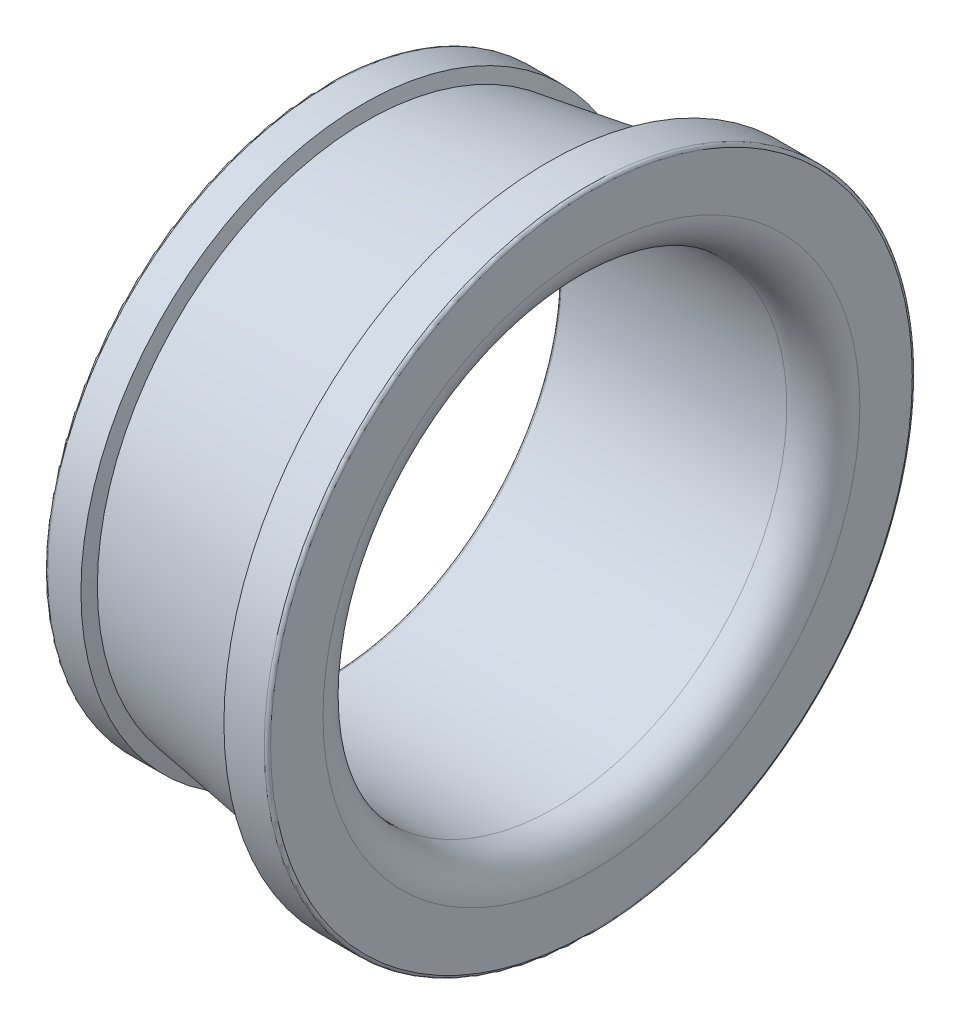
ISO-10303-21;
HEADER;
FILE_DESCRIPTION(('STEP AP214'),'2;1');
FILE_NAME('part.step','',(''),(''),'','','');
FILE_SCHEMA(('AUTOMOTIVE_DESIGN { 1 0 10303 214 1 1 1 1 }'));
ENDSEC;
DATA;
#1=APPLICATION_CONTEXT('core data for automotive mechanical design processes');
#2=APPLICATION_PROTOCOL_DEFINITION('international standard','automotive_design',2000,#1);
#3=PRODUCT_CONTEXT('',#1,'mechanical');
#4=PRODUCT('Part','Part','',(#3));
#5=PRODUCT_RELATED_PRODUCT_CATEGORY('part','',(#4));
#6=PRODUCT_DEFINITION_FORMATION('','',#4);
#7=PRODUCT_DEFINITION_CONTEXT('part definition',#1,'design');
#8=PRODUCT_DEFINITION('design','',#6,#7);
#9=PRODUCT_DEFINITION_SHAPE('','',#8);
#10=(LENGTH_UNIT() NAMED_UNIT(*) SI_UNIT(.MILLI.,.METRE.));
#11=(NAMED_UNIT(*) PLANE_ANGLE_UNIT() SI_UNIT($,.RADIAN.));
#12=(NAMED_UNIT(*) SI_UNIT($,.STERADIAN.) SOLID_ANGLE_UNIT());
#13=UNCERTAINTY_MEASURE_WITH_UNIT(LENGTH_MEASURE(1.E-05),#10,'distance_accuracy_value','');
#14=(GEOMETRIC_REPRESENTATION_CONTEXT(3) GLOBAL_UNCERTAINTY_ASSIGNED_CONTEXT((#13)) GLOBAL_UNIT_ASSIGNED_CONTEXT((#10,
#11,#12)) REPRESENTATION_CONTEXT('',''));
#15=CARTESIAN_POINT('',(0.,0.,0.));
#16=DIRECTION('',(0.,0.,1.));
#17=DIRECTION('',(1.,0.,0.));
#18=AXIS2_PLACEMENT_3D('',#15,#16,#17);
#19=CARTESIAN_POINT('',(20.3759999999997,2.22044604925031E-13,6.66133814775094E-13));
#20=DIRECTION('',(-1.,0.,0.));
#21=DIRECTION('',(0.,0.,1.));
#22=AXIS2_PLACEMENT_3D('',#19,#20,#21);
#23=TOROIDAL_SURFACE('',#22,25.7249999999996,3.49999999999972);
#24=CARTESIAN_POINT('',(23.8759999999995,2.2046276398927E-13,6.66904734211059E-13));
#25=DIRECTION('',(1.,0.,0.));
#26=DIRECTION('',(0.,0.,1.));
#27=AXIS2_PLACEMENT_3D('',#24,#25,#26);
#28=CIRCLE('',#27,25.7249999999996);
#29=CARTESIAN_POINT('',(23.876,2.22044604925031E-13,25.725));
#30=VERTEX_POINT('',#29);
#31=CARTESIAN_POINT('',(23.8759999999997,6.66133814775094E-13,-25.7249999999998));
#32=VERTEX_POINT('',#31);
#33=EDGE_CURVE('E61',#30,#32,#28,.T.);
#34=ORIENTED_EDGE('',*,*,#33,.T.);
#35=CARTESIAN_POINT('',(23.8759999999995,2.2046276398927E-13,6.66904734211059E-13));
#36=DIRECTION('',(1.,0.,0.));
#37=DIRECTION('',(0.,0.,-1.));
#38=AXIS2_PLACEMENT_3D('',#35,#36,#37);
#39=CIRCLE('',#38,25.7249999999996);
#40=EDGE_CURVE('E58',#32,#30,#39,.T.);
#41=ORIENTED_EDGE('',*,*,#40,.T.);
#42=EDGE_LOOP('',(#34,#41));
#43=FACE_BOUND('',#42,.T.);
#44=CARTESIAN_POINT('',(20.3759999999998,-2.22044604925031E-13,0.));
#45=DIRECTION('',(-1.,0.,0.));
#46=DIRECTION('',(0.,0.,1.));
#47=AXIS2_PLACEMENT_3D('',#44,#45,#46);
#48=CIRCLE('',#47,22.225);
#49=CARTESIAN_POINT('',(20.3759999999998,-2.30063884609777E-13,22.225));
#50=VERTEX_POINT('',#49);
#51=EDGE_CURVE('E109',#50,#50,#48,.T.);
#52=ORIENTED_EDGE('',*,*,#51,.T.);
#53=EDGE_LOOP('',(#52));
#54=FACE_BOUND('',#53,.T.);
#55=ADVANCED_FACE('F17',(#43,#54),#23,.T.);
#56=CARTESIAN_POINT('',(23.8759999999996,25.7250000000004,4.44089209850063E-13));
#57=DIRECTION('',(-1.,0.,0.));
#58=DIRECTION('',(0.,0.,1.));
#59=AXIS2_PLACEMENT_3D('',#56,#57,#58);
#60=PLANE('',#59);
#61=ORIENTED_EDGE('',*,*,#33,.F.);
#62=ORIENTED_EDGE('',*,*,#40,.F.);
#63=EDGE_LOOP('',(#61,#62));
#64=FACE_BOUND('',#63,.T.);
#65=CARTESIAN_POINT('',(23.8759999999997,2.21909018559109E-13,6.66199893583891E-13));
#66=DIRECTION('',(-1.,0.,0.));
#67=DIRECTION('',(0.,0.,-1.));
#68=AXIS2_PLACEMENT_3D('',#65,#66,#67);
#69=CIRCLE('',#68,30.7500000000002);
#70=CARTESIAN_POINT('',(23.8759999999998,2.22044604925031E-13,-30.7499999999996));
#71=VERTEX_POINT('',#70);
#72=CARTESIAN_POINT('',(23.8759999999996,2.22044604925031E-13,30.7500000000001));
#73=VERTEX_POINT('',#72);
#74=EDGE_CURVE('E69',#71,#73,#69,.T.);
#75=ORIENTED_EDGE('',*,*,#74,.F.);
#76=CARTESIAN_POINT('',(23.8759999999997,2.21909018559109E-13,6.66199893583891E-13));
#77=DIRECTION('',(-1.,0.,0.));
#78=DIRECTION('',(0.,0.,1.));
#79=AXIS2_PLACEMENT_3D('',#76,#77,#78);
#80=CIRCLE('',#79,30.7500000000002);
#81=EDGE_CURVE('E105',#73,#71,#80,.T.);
#82=ORIENTED_EDGE('',*,*,#81,.F.);
#83=EDGE_LOOP('',(#75,#82));
#84=FACE_BOUND('',#83,.T.);
#85=ADVANCED_FACE('F67',(#64,#84),#60,.F.);
#86=CARTESIAN_POINT('',(23.8759999999998,0.,-2.22044604925031E-13));
#87=DIRECTION('',(-1.,0.,0.));
#88=DIRECTION('',(0.,0.,1.));
#89=AXIS2_PLACEMENT_3D('',#86,#87,#88);
#90=CYLINDRICAL_SURFACE('',#89,22.225);
#91=ORIENTED_EDGE('',*,*,#51,.F.);
#92=EDGE_LOOP('',(#91));
#93=FACE_BOUND('',#92,.T.);
#94=CARTESIAN_POINT('',(-1.22400000000022,0.,0.));
#95=DIRECTION('',(-1.,0.,0.));
#96=DIRECTION('',(0.,0.,1.));
#97=AXIS2_PLACEMENT_3D('',#94,#95,#96);
#98=CIRCLE('',#97,22.225);
#99=CARTESIAN_POINT('',(-1.22400000000022,0.,22.225));
#100=VERTEX_POINT('',#99);
#101=EDGE_CURVE('E108',#100,#100,#98,.F.);
#102=ORIENTED_EDGE('',*,*,#101,.F.);
#103=EDGE_LOOP('',(#102));
#104=FACE_BOUND('',#103,.T.);
#105=ADVANCED_FACE('F87',(#93,#104),#90,.F.);
#106=CARTESIAN_POINT('',(23.5759999999998,2.22044604925031E-13,6.66133814775094E-13));
#107=DIRECTION('',(-1.,0.,0.));
#108=DIRECTION('',(0.,0.,1.));
#109=AXIS2_PLACEMENT_3D('',#106,#107,#108);
#110=TOROIDAL_SURFACE('',#109,30.7500000000003,0.29999999999988);
#111=CARTESIAN_POINT('',(23.5759999999996,2.22044604925031E-13,6.66133814775094E-13));
#112=DIRECTION('',(-1.,0.,0.));
#113=DIRECTION('',(0.,0.,1.));
#114=AXIS2_PLACEMENT_3D('',#111,#112,#113);
#115=CIRCLE('',#114,31.05);
#116=CARTESIAN_POINT('',(23.5759999999996,2.10841066827783E-13,31.0500000000007));
#117=VERTEX_POINT('',#116);
#118=EDGE_CURVE('E140',#117,#117,#115,.T.);
#119=ORIENTED_EDGE('',*,*,#118,.F.);
#120=EDGE_LOOP('',(#119));
#121=FACE_BOUND('',#120,.T.);
#122=ORIENTED_EDGE('',*,*,#81,.T.);
#123=ORIENTED_EDGE('',*,*,#74,.T.);
#124=EDGE_LOOP('',(#122,#123));
#125=FACE_BOUND('',#124,.T.);
#126=ADVANCED_FACE('F111',(#121,#125),#110,.T.);
#127=CARTESIAN_POINT('',(-1.22400000000033,0.,0.));
#128=DIRECTION('',(-1.,0.,0.));
#129=DIRECTION('',(0.,0.,1.));
#130=AXIS2_PLACEMENT_3D('',#127,#128,#129);
#131=TOROIDAL_SURFACE('',#130,22.5249999999997,0.299999999999873);
#132=ORIENTED_EDGE('',*,*,#101,.T.);
#133=EDGE_LOOP('',(#132));
#134=FACE_BOUND('',#133,.T.);
#135=CARTESIAN_POINT('',(-1.5240000000002,0.,0.));
#136=DIRECTION('',(-1.,0.,0.));
#137=DIRECTION('',(0.,0.,1.));
#138=AXIS2_PLACEMENT_3D('',#135,#136,#137);
#139=CIRCLE('',#138,22.5249999999997);
#140=CARTESIAN_POINT('',(-1.52399999999986,2.22044604925031E-13,22.5249999999999));
#141=VERTEX_POINT('',#140);
#142=CARTESIAN_POINT('',(-1.52400000000041,4.44089209850063E-13,-22.5249999999995));
#143=VERTEX_POINT('',#142);
#144=EDGE_CURVE('E148',#141,#143,#139,.T.);
#145=ORIENTED_EDGE('',*,*,#144,.T.);
#146=CARTESIAN_POINT('',(-1.5240000000002,0.,0.));
#147=DIRECTION('',(-1.,0.,0.));
#148=DIRECTION('',(0.,0.,-1.));
#149=AXIS2_PLACEMENT_3D('',#146,#147,#148);
#150=CIRCLE('',#149,22.5249999999997);
#151=EDGE_CURVE('E144',#143,#141,#150,.T.);
#152=ORIENTED_EDGE('',*,*,#151,.T.);
#153=EDGE_LOOP('',(#145,#152));
#154=FACE_BOUND('',#153,.T.);
#155=ADVANCED_FACE('F127',(#134,#154),#131,.T.);
#156=CARTESIAN_POINT('',(23.8759999999998,0.,-2.22044604925031E-13));
#157=DIRECTION('',(-1.,0.,0.));
#158=DIRECTION('',(0.,0.,1.));
#159=AXIS2_PLACEMENT_3D('',#156,#157,#158);
#160=CYLINDRICAL_SURFACE('',#159,31.05);
#161=CARTESIAN_POINT('',(19.7079999999997,-2.22044604925031E-13,0.));
#162=DIRECTION('',(-1.,0.,0.));
#163=DIRECTION('',(0.,0.,1.));
#164=AXIS2_PLACEMENT_3D('',#161,#162,#163);
#165=CIRCLE('',#164,31.05);
#166=CARTESIAN_POINT('',(19.7079999999997,-2.3324814302228E-13,31.05));
#167=VERTEX_POINT('',#166);
#168=EDGE_CURVE('E158',#167,#167,#165,.F.);
#169=ORIENTED_EDGE('',*,*,#168,.T.);
#170=EDGE_LOOP('',(#169));
#171=FACE_BOUND('',#170,.T.);
#172=ORIENTED_EDGE('',*,*,#118,.T.);
#173=EDGE_LOOP('',(#172));
#174=FACE_BOUND('',#173,.T.);
#175=ADVANCED_FACE('F177',(#171,#174),#160,.T.);
#176=CARTESIAN_POINT('',(-1.52400000000041,26.7029999999997,-2.22044604925031E-13));
#177=DIRECTION('',(1.,0.,0.));
#178=DIRECTION('',(0.,0.,-1.));
#179=AXIS2_PLACEMENT_3D('',#176,#177,#178);
#180=PLANE('',#179);
#181=CARTESIAN_POINT('',(-1.52400000000021,0.,0.));
#182=DIRECTION('',(1.,0.,0.));
#183=DIRECTION('',(0.,0.,1.));
#184=AXIS2_PLACEMENT_3D('',#181,#182,#183);
#185=CIRCLE('',#184,26.7030000000005);
#186=CARTESIAN_POINT('',(-1.52400000000019,-4.44089209850063E-13,26.7030000000001));
#187=VERTEX_POINT('',#186);
#188=CARTESIAN_POINT('',(-1.52400000000019,2.22044604925031E-13,-26.7029999999997));
#189=VERTEX_POINT('',#188);
#190=EDGE_CURVE('E37',#187,#189,#185,.T.);
#191=ORIENTED_EDGE('',*,*,#190,.F.);
#192=CARTESIAN_POINT('',(-1.52400000000021,0.,0.));
#193=DIRECTION('',(1.,0.,0.));
#194=DIRECTION('',(0.,0.,-1.));
#195=AXIS2_PLACEMENT_3D('',#192,#193,#194);
#196=CIRCLE('',#195,26.7030000000005);
#197=EDGE_CURVE('E194',#189,#187,#196,.T.);
#198=ORIENTED_EDGE('',*,*,#197,.F.);
#199=EDGE_LOOP('',(#191,#198));
#200=FACE_BOUND('',#199,.T.);
#201=ORIENTED_EDGE('',*,*,#151,.F.);
#202=ORIENTED_EDGE('',*,*,#144,.F.);
#203=EDGE_LOOP('',(#201,#202));
#204=FACE_BOUND('',#203,.T.);
#205=ADVANCED_FACE('F160',(#200,#204),#180,.F.);
#206=CARTESIAN_POINT('',(19.7079999999997,-2.22044604925031E-13,0.));
#207=DIRECTION('',(-1.,0.,0.));
#208=DIRECTION('',(0.,0.,1.));
#209=AXIS2_PLACEMENT_3D('',#206,#207,#208);
#210=CONICAL_SURFACE('',#209,31.05,1.4221043597805);
#211=CARTESIAN_POINT('',(20.0557783010276,0.,2.22044604925031E-13));
#212=DIRECTION('',(-1.,0.,0.));
#213=DIRECTION('',(0.,0.,1.));
#214=AXIS2_PLACEMENT_3D('',#211,#212,#213);
#215=CIRCLE('',#214,28.728344855303);
#216=CARTESIAN_POINT('',(20.0557783010276,0.,28.7283448553032));
#217=VERTEX_POINT('',#216);
#218=EDGE_CURVE('E220',#217,#217,#215,.F.);
#219=ORIENTED_EDGE('',*,*,#218,.T.);
#220=EDGE_LOOP('',(#219));
#221=FACE_BOUND('',#220,.T.);
#222=ORIENTED_EDGE('',*,*,#168,.F.);
#223=EDGE_LOOP('',(#222));
#224=FACE_BOUND('',#223,.T.);
#225=ADVANCED_FACE('F176',(#221,#224),#210,.F.);
#226=CARTESIAN_POINT('',(-1.22400000000033,0.,0.));
#227=DIRECTION('',(-1.,0.,0.));
#228=DIRECTION('',(0.,0.,1.));
#229=AXIS2_PLACEMENT_3D('',#226,#227,#228);
#230=TOROIDAL_SURFACE('',#229,26.7030000000006,0.299999999999878);
#231=ORIENTED_EDGE('',*,*,#190,.T.);
#232=ORIENTED_EDGE('',*,*,#197,.T.);
#233=EDGE_LOOP('',(#231,#232));
#234=FACE_BOUND('',#233,.T.);
#235=CARTESIAN_POINT('',(-1.22400000000022,0.,0.));
#236=DIRECTION('',(-1.,0.,0.));
#237=DIRECTION('',(0.,0.,1.));
#238=AXIS2_PLACEMENT_3D('',#235,#236,#237);
#239=CIRCLE('',#238,27.003);
#240=CARTESIAN_POINT('',(-1.22400000000022,0.,27.003));
#241=VERTEX_POINT('',#240);
#242=EDGE_CURVE('E150',#241,#241,#239,.F.);
#243=ORIENTED_EDGE('',*,*,#242,.F.);
#244=EDGE_LOOP('',(#243));
#245=FACE_BOUND('',#244,.T.);
#246=ADVANCED_FACE('F206',(#234,#245),#230,.T.);
#247=CARTESIAN_POINT('',(23.8759999999998,0.,-2.22044604925031E-13));
#248=DIRECTION('',(-1.,0.,0.));
#249=DIRECTION('',(0.,0.,1.));
#250=AXIS2_PLACEMENT_3D('',#247,#248,#249);
#251=CYLINDRICAL_SURFACE('',#250,27.003);
#252=ORIENTED_EDGE('',*,*,#242,.T.);
#253=EDGE_LOOP('',(#252));
#254=FACE_BOUND('',#253,.T.);
#255=CARTESIAN_POINT('',(1.96000000000007,0.,0.));
#256=DIRECTION('',(-1.,0.,0.));
#257=DIRECTION('',(0.,0.,1.));
#258=AXIS2_PLACEMENT_3D('',#255,#256,#257);
#259=CIRCLE('',#258,27.003);
#260=CARTESIAN_POINT('',(1.96000000000008,0.,27.003));
#261=VERTEX_POINT('',#260);
#262=EDGE_CURVE('E223',#261,#261,#259,.F.);
#263=ORIENTED_EDGE('',*,*,#262,.F.);
#264=EDGE_LOOP('',(#263));
#265=FACE_BOUND('',#264,.T.);
#266=ADVANCED_FACE('F215',(#254,#265),#251,.T.);
#267=CARTESIAN_POINT('',(1.96000000000007,0.,0.));
#268=DIRECTION('',(-1.,0.,0.));
#269=DIRECTION('',(0.,0.,1.));
#270=AXIS2_PLACEMENT_3D('',#267,#268,#269);
#271=CONICAL_SURFACE('',#270,27.003,1.3029006686597);
#272=ORIENTED_EDGE('',*,*,#262,.T.);
#273=EDGE_LOOP('',(#272));
#274=FACE_BOUND('',#273,.T.);
#275=CARTESIAN_POINT('',(2.2989999999995,-2.22044604925031E-13,-2.22044604925031E-13));
#276=DIRECTION('',(1.,0.,0.));
#277=DIRECTION('',(0.,0.,-1.));
#278=AXIS2_PLACEMENT_3D('',#275,#276,#277);
#279=CIRCLE('',#278,25.768);
#280=CARTESIAN_POINT('',(2.29899999999949,-2.11316519838078E-13,-25.7680000000002));
#281=VERTEX_POINT('',#280);
#282=EDGE_CURVE('E29',#281,#281,#279,.T.);
#283=ORIENTED_EDGE('',*,*,#282,.F.);
#284=EDGE_LOOP('',(#283));
#285=FACE_BOUND('',#284,.T.);
#286=ADVANCED_FACE('F233',(#274,#285),#271,.T.);
#287=CARTESIAN_POINT('',(20.0779999999998,0.,-2.22044604925031E-13));
#288=DIRECTION('',(-1.,0.,0.));
#289=DIRECTION('',(0.,0.,1.));
#290=AXIS2_PLACEMENT_3D('',#287,#288,#289);
#291=TOROIDAL_SURFACE('',#290,28.5800000000007,0.149999999999998);
#292=ORIENTED_EDGE('',*,*,#218,.F.);
#293=EDGE_LOOP('',(#292));
#294=FACE_BOUND('',#293,.T.);
#295=CARTESIAN_POINT('',(19.9298417089648,-2.22044604925031E-13,0.));
#296=DIRECTION('',(1.,0.,0.));
#297=DIRECTION('',(0.,0.,-1.));
#298=AXIS2_PLACEMENT_3D('',#295,#296,#297);
#299=CIRCLE('',#298,28.556566673357);
#300=CARTESIAN_POINT('',(19.9298417089648,-2.10155545740655E-13,-28.556566673357));
#301=VERTEX_POINT('',#300);
#302=EDGE_CURVE('E11',#301,#301,#299,.F.);
#303=ORIENTED_EDGE('',*,*,#302,.F.);
#304=EDGE_LOOP('',(#303));
#305=FACE_BOUND('',#304,.T.);
#306=ADVANCED_FACE('F229',(#294,#305),#291,.F.);
#307=CARTESIAN_POINT('',(19.9298417089648,-2.22044604925031E-13,0.));
#308=DIRECTION('',(1.,0.,0.));
#309=DIRECTION('',(0.,0.,-1.));
#310=AXIS2_PLACEMENT_3D('',#307,#308,#309);
#311=CONICAL_SURFACE('',#310,28.556566673357,0.15686470272828);
#312=ORIENTED_EDGE('',*,*,#302,.T.);
#313=EDGE_LOOP('',(#312));
#314=FACE_BOUND('',#313,.T.);
#315=ORIENTED_EDGE('',*,*,#282,.T.);
#316=EDGE_LOOP('',(#315));
#317=FACE_BOUND('',#316,.T.);
#318=ADVANCED_FACE('F232',(#314,#317),#311,.T.);
#319=CLOSED_SHELL('',(#55,#85,#105,#126,#155,#175,#205,#225,#246,#266,#286,#306,#318));
#320=MANIFOLD_SOLID_BREP('B1',#319);
#321=ADVANCED_BREP_SHAPE_REPRESENTATION('',(#18,#320),#14);
#322=SHAPE_DEFINITION_REPRESENTATION(#9,#321);
ENDSEC;
END-ISO-10303-21;
